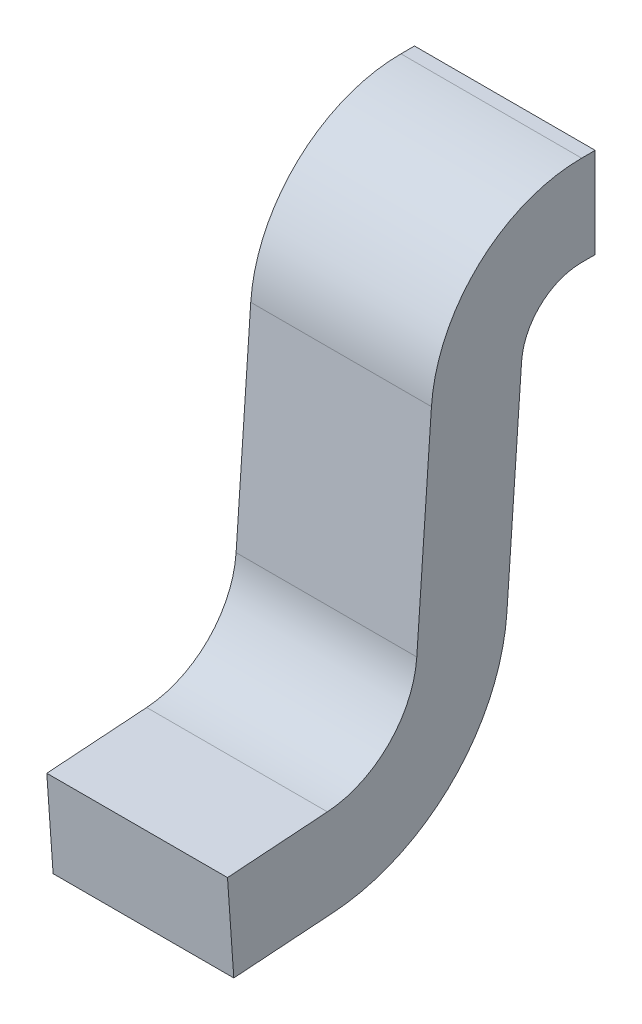
ISO-10303-21;
HEADER;
FILE_DESCRIPTION(('STEP AP214'),'2;1');
FILE_NAME('part.step','',(''),(''),'','','');
FILE_SCHEMA(('AUTOMOTIVE_DESIGN { 1 0 10303 214 1 1 1 1 }'));
ENDSEC;
DATA;
#1=APPLICATION_CONTEXT('core data for automotive mechanical design processes');
#2=APPLICATION_PROTOCOL_DEFINITION('international standard','automotive_design',2000,#1);
#3=PRODUCT_CONTEXT('',#1,'mechanical');
#4=PRODUCT('Part','Part','',(#3));
#5=PRODUCT_RELATED_PRODUCT_CATEGORY('part','',(#4));
#6=PRODUCT_DEFINITION_FORMATION('','',#4);
#7=PRODUCT_DEFINITION_CONTEXT('part definition',#1,'design');
#8=PRODUCT_DEFINITION('design','',#6,#7);
#9=PRODUCT_DEFINITION_SHAPE('','',#8);
#10=(LENGTH_UNIT() NAMED_UNIT(*) SI_UNIT(.MILLI.,.METRE.));
#11=(NAMED_UNIT(*) PLANE_ANGLE_UNIT() SI_UNIT($,.RADIAN.));
#12=(NAMED_UNIT(*) SI_UNIT($,.STERADIAN.) SOLID_ANGLE_UNIT());
#13=UNCERTAINTY_MEASURE_WITH_UNIT(LENGTH_MEASURE(1.E-05),#10,'distance_accuracy_value','');
#14=(GEOMETRIC_REPRESENTATION_CONTEXT(3) GLOBAL_UNCERTAINTY_ASSIGNED_CONTEXT((#13)) GLOBAL_UNIT_ASSIGNED_CONTEXT((#10,
#11,#12)) REPRESENTATION_CONTEXT('',''));
#15=CARTESIAN_POINT('',(0.,0.,0.));
#16=DIRECTION('',(0.,0.,1.));
#17=DIRECTION('',(1.,0.,0.));
#18=AXIS2_PLACEMENT_3D('',#15,#16,#17);
#19=CARTESIAN_POINT('',(0.15,0.,0.));
#20=DIRECTION('',(1.,0.,0.));
#21=DIRECTION('',(0.,1.,0.));
#22=AXIS2_PLACEMENT_3D('',#19,#20,#21);
#23=PLANE('',#22);
#24=DIRECTION('',(0.,-0.997564050259825,0.0697564737441177));
#25=VECTOR('',#24,1.);
#26=CARTESIAN_POINT('',(0.15,0.407439118436,0.121875366099));
#27=LINE('',#26,#25);
#28=CARTESIAN_POINT('',(0.15,0.407439118436,0.121875366099));
#29=VERTEX_POINT('',#28);
#30=CARTESIAN_POINT('',(0.15,0.05967916399889,0.146193111034));
#31=VERTEX_POINT('',#30);
#32=EDGE_CURVE('E11',#29,#31,#27,.T.);
#33=ORIENTED_EDGE('',*,*,#32,.T.);
#34=CARTESIAN_POINT('',(0.15,0.07084019979795,0.305803359076));
#35=DIRECTION('',(1.,0.,0.));
#36=DIRECTION('',(0.,-0.997564050259825,-0.0697564737441178));
#37=AXIS2_PLACEMENT_3D('',#34,#35,#36);
#38=CIRCLE('',#37,0.16);
#39=CARTESIAN_POINT('',(0.15,-0.08877004824362,0.294642323277));
#40=VERTEX_POINT('',#39);
#41=EDGE_CURVE('E42',#40,#31,#38,.T.);
#42=ORIENTED_EDGE('',*,*,#41,.F.);
#43=DIRECTION('',(0.,-0.0697564737441177,0.997564050259825));
#44=VECTOR('',#43,1.);
#45=CARTESIAN_POINT('',(0.15,-0.08877004824362,0.294642323277));
#46=LINE('',#45,#44);
#47=CARTESIAN_POINT('',(0.15,-0.100365392461,0.460463471062));
#48=VERTEX_POINT('',#47);
#49=EDGE_CURVE('E255',#40,#48,#46,.T.);
#50=ORIENTED_EDGE('',*,*,#49,.T.);
#51=DIRECTION('',(0.,-0.997564050259825,-0.0697564737441177));
#52=VECTOR('',#51,1.);
#53=CARTESIAN_POINT('',(0.15,-0.100365392461,0.460463471062));
#54=LINE('',#53,#52);
#55=CARTESIAN_POINT('',(0.15,-0.25,0.45));
#56=VERTEX_POINT('',#55);
#57=EDGE_CURVE('E234',#48,#56,#54,.T.);
#58=ORIENTED_EDGE('',*,*,#57,.T.);
#59=DIRECTION('',(0.,0.0697564737441177,-0.997564050259825));
#60=VECTOR('',#59,1.);
#61=CARTESIAN_POINT('',(0.15,-0.25,0.45));
#62=LINE('',#61,#60);
#63=CARTESIAN_POINT('',(0.15,-0.238404655783,0.284178852215));
#64=VERTEX_POINT('',#63);
#65=EDGE_CURVE('E235',#56,#64,#62,.T.);
#66=ORIENTED_EDGE('',*,*,#65,.T.);
#67=CARTESIAN_POINT('',(0.15,0.07084019979795,0.305803359076));
#68=DIRECTION('',(-1.,0.,0.));
#69=DIRECTION('',(0.,-0.0697564737441178,-0.997564050259825));
#70=AXIS2_PLACEMENT_3D('',#67,#68,#69);
#71=CIRCLE('',#70,0.31);
#72=CARTESIAN_POINT('',(0.15,0.04921569293727,-0.003441496504694));
#73=VERTEX_POINT('',#72);
#74=EDGE_CURVE('E239',#73,#64,#71,.T.);
#75=ORIENTED_EDGE('',*,*,#74,.F.);
#76=DIRECTION('',(0.,0.997564050259825,-0.0697564737441177));
#77=VECTOR('',#76,1.);
#78=CARTESIAN_POINT('',(0.15,0.04921569293727,-0.003441496504694));
#79=LINE('',#78,#77);
#80=CARTESIAN_POINT('',(0.15,0.396975647374,-0.0277592414401));
#81=VERTEX_POINT('',#80);
#82=EDGE_CURVE('E226',#73,#81,#79,.T.);
#83=ORIENTED_EDGE('',*,*,#82,.T.);
#84=CARTESIAN_POINT('',(0.15,0.39,-0.127515646466));
#85=DIRECTION('',(-1.,0.,0.));
#86=DIRECTION('',(0.,0.0697564737441177,0.997564050259825));
#87=AXIS2_PLACEMENT_3D('',#84,#85,#86);
#88=CIRCLE('',#87,0.1);
#89=CARTESIAN_POINT('',(0.15,0.49,-0.127515646466));
#90=VERTEX_POINT('',#89);
#91=EDGE_CURVE('E172',#81,#90,#88,.T.);
#92=ORIENTED_EDGE('',*,*,#91,.T.);
#93=DIRECTION('',(0.,0.,-1.));
#94=VECTOR('',#93,1.);
#95=CARTESIAN_POINT('',(0.15,0.49,-0.127515646466));
#96=LINE('',#95,#94);
#97=CARTESIAN_POINT('',(0.15,0.49,-0.15));
#98=VERTEX_POINT('',#97);
#99=EDGE_CURVE('E173',#90,#98,#96,.T.);
#100=ORIENTED_EDGE('',*,*,#99,.T.);
#101=DIRECTION('',(0.,1.,0.));
#102=VECTOR('',#101,1.);
#103=CARTESIAN_POINT('',(0.15,0.49,-0.15));
#104=LINE('',#103,#102);
#105=CARTESIAN_POINT('',(0.15,0.64,-0.15));
#106=VERTEX_POINT('',#105);
#107=EDGE_CURVE('E144',#98,#106,#104,.T.);
#108=ORIENTED_EDGE('',*,*,#107,.T.);
#109=DIRECTION('',(0.,0.,1.));
#110=VECTOR('',#109,1.);
#111=CARTESIAN_POINT('',(0.15,0.64,-0.15));
#112=LINE('',#111,#110);
#113=CARTESIAN_POINT('',(0.15,0.64,-0.127515646466));
#114=VERTEX_POINT('',#113);
#115=EDGE_CURVE('E140',#106,#114,#112,.T.);
#116=ORIENTED_EDGE('',*,*,#115,.T.);
#117=CARTESIAN_POINT('',(0.15,0.39,-0.127515646466));
#118=DIRECTION('',(1.,0.,0.));
#119=DIRECTION('',(0.,1.,0.));
#120=AXIS2_PLACEMENT_3D('',#117,#118,#119);
#121=CIRCLE('',#120,0.25);
#122=EDGE_CURVE('E211',#114,#29,#121,.T.);
#123=ORIENTED_EDGE('',*,*,#122,.T.);
#124=EDGE_LOOP('',(#33,#42,#50,#58,#66,#75,#83,#92,#100,#108,#116,#123));
#125=FACE_BOUND('',#124,.T.);
#126=ADVANCED_FACE('F17',(#125),#23,.T.);
#127=CARTESIAN_POINT('',(-0.15,0.01046347106162,0.149634607539));
#128=DIRECTION('',(0.,0.0697564737441177,0.997564050259825));
#129=DIRECTION('',(1.,0.,0.));
#130=AXIS2_PLACEMENT_3D('',#127,#128,#129);
#131=PLANE('',#130);
#132=DIRECTION('',(0.,0.997564050259825,-0.0697564737441177));
#133=VECTOR('',#132,1.);
#134=CARTESIAN_POINT('',(-0.15,0.05967916399889,0.146193111034));
#135=LINE('',#134,#133);
#136=CARTESIAN_POINT('',(-0.15,0.05967916399889,0.146193111034));
#137=VERTEX_POINT('',#136);
#138=CARTESIAN_POINT('',(-0.15,0.407439118436,0.121875366099));
#139=VERTEX_POINT('',#138);
#140=EDGE_CURVE('E195',#137,#139,#135,.T.);
#141=ORIENTED_EDGE('',*,*,#140,.F.);
#142=DIRECTION('',(1.,0.,0.));
#143=VECTOR('',#142,1.);
#144=CARTESIAN_POINT('',(-0.15,0.05967916399889,0.146193111034));
#145=LINE('',#144,#143);
#146=EDGE_CURVE('E25',#137,#31,#145,.T.);
#147=ORIENTED_EDGE('',*,*,#146,.T.);
#148=ORIENTED_EDGE('',*,*,#32,.F.);
#149=DIRECTION('',(-1.,0.,0.));
#150=VECTOR('',#149,1.);
#151=CARTESIAN_POINT('',(0.15,0.407439118436,0.121875366099));
#152=LINE('',#151,#150);
#153=EDGE_CURVE('E214',#29,#139,#152,.T.);
#154=ORIENTED_EDGE('',*,*,#153,.T.);
#155=EDGE_LOOP('',(#141,#147,#148,#154));
#156=FACE_BOUND('',#155,.T.);
#157=ADVANCED_FACE('F267',(#156),#131,.T.);
#158=CARTESIAN_POINT('',(-0.15,0.07084019979795,0.305803359076));
#159=DIRECTION('',(1.,0.,0.));
#160=DIRECTION('',(0.,-0.997564050259825,-0.0697564737441178));
#161=AXIS2_PLACEMENT_3D('',#158,#159,#160);
#162=CYLINDRICAL_SURFACE('',#161,0.16);
#163=ORIENTED_EDGE('',*,*,#41,.T.);
#164=ORIENTED_EDGE('',*,*,#146,.F.);
#165=CARTESIAN_POINT('',(-0.15,0.07084019979795,0.305803359076));
#166=DIRECTION('',(1.,0.,0.));
#167=DIRECTION('',(0.,-0.997564050259825,-0.0697564737441178));
#168=AXIS2_PLACEMENT_3D('',#165,#166,#167);
#169=CIRCLE('',#168,0.16);
#170=CARTESIAN_POINT('',(-0.15,-0.08877004824362,0.294642323277));
#171=VERTEX_POINT('',#170);
#172=EDGE_CURVE('E181',#171,#137,#169,.T.);
#173=ORIENTED_EDGE('',*,*,#172,.F.);
#174=DIRECTION('',(1.,0.,0.));
#175=VECTOR('',#174,1.);
#176=CARTESIAN_POINT('',(-0.15,-0.08877004824362,0.294642323277));
#177=LINE('',#176,#175);
#178=EDGE_CURVE('E258',#171,#40,#177,.T.);
#179=ORIENTED_EDGE('',*,*,#178,.T.);
#180=EDGE_LOOP('',(#163,#164,#173,#179));
#181=FACE_BOUND('',#180,.T.);
#182=ADVANCED_FACE('F270',(#181),#162,.F.);
#183=CARTESIAN_POINT('',(-0.15,-0.0790679078432,0.155895251435));
#184=DIRECTION('',(0.,0.997564050259825,0.0697564737441177));
#185=DIRECTION('',(1.,0.,0.));
#186=AXIS2_PLACEMENT_3D('',#183,#184,#185);
#187=PLANE('',#186);
#188=DIRECTION('',(1.,0.,0.));
#189=VECTOR('',#188,1.);
#190=CARTESIAN_POINT('',(-0.15,-0.100365392461,0.460463471062));
#191=LINE('',#190,#189);
#192=CARTESIAN_POINT('',(-0.15,-0.100365392461,0.460463471062));
#193=VERTEX_POINT('',#192);
#194=EDGE_CURVE('E251',#193,#48,#191,.T.);
#195=ORIENTED_EDGE('',*,*,#194,.T.);
#196=ORIENTED_EDGE('',*,*,#49,.F.);
#197=ORIENTED_EDGE('',*,*,#178,.F.);
#198=DIRECTION('',(0.,-0.0697564737441177,0.997564050259825));
#199=VECTOR('',#198,1.);
#200=CARTESIAN_POINT('',(-0.15,-0.08877004824362,0.294642323277));
#201=LINE('',#200,#199);
#202=EDGE_CURVE('E177',#171,#193,#201,.T.);
#203=ORIENTED_EDGE('',*,*,#202,.T.);
#204=EDGE_LOOP('',(#195,#196,#197,#203));
#205=FACE_BOUND('',#204,.T.);
#206=ADVANCED_FACE('F274',(#205),#187,.T.);
#207=CARTESIAN_POINT('',(-0.15,-0.100365392461,0.460463471062));
#208=DIRECTION('',(0.,-0.0697564737441177,0.997564050259825));
#209=DIRECTION('',(-1.,0.,0.));
#210=AXIS2_PLACEMENT_3D('',#207,#208,#209);
#211=PLANE('',#210);
#212=DIRECTION('',(1.,0.,0.));
#213=VECTOR('',#212,1.);
#214=CARTESIAN_POINT('',(-0.15,-0.25,0.45));
#215=LINE('',#214,#213);
#216=CARTESIAN_POINT('',(-0.15,-0.25,0.45));
#217=VERTEX_POINT('',#216);
#218=EDGE_CURVE('E230',#217,#56,#215,.T.);
#219=ORIENTED_EDGE('',*,*,#218,.T.);
#220=ORIENTED_EDGE('',*,*,#57,.F.);
#221=ORIENTED_EDGE('',*,*,#194,.F.);
#222=DIRECTION('',(0.,-0.997564050259825,-0.0697564737441177));
#223=VECTOR('',#222,1.);
#224=CARTESIAN_POINT('',(-0.15,-0.100365392461,0.460463471062));
#225=LINE('',#224,#223);
#226=EDGE_CURVE('E182',#193,#217,#225,.T.);
#227=ORIENTED_EDGE('',*,*,#226,.T.);
#228=EDGE_LOOP('',(#219,#220,#221,#227));
#229=FACE_BOUND('',#228,.T.);
#230=ADVANCED_FACE('F278',(#229),#211,.T.);
#231=CARTESIAN_POINT('',(-0.15,-0.25,0.45));
#232=DIRECTION('',(0.,-0.997564050259825,-0.0697564737441177));
#233=DIRECTION('',(0.,0.0697564737441177,-0.997564050259825));
#234=AXIS2_PLACEMENT_3D('',#231,#232,#233);
#235=PLANE('',#234);
#236=DIRECTION('',(1.,0.,0.));
#237=VECTOR('',#236,1.);
#238=CARTESIAN_POINT('',(-0.15,-0.238404655783,0.284178852215));
#239=LINE('',#238,#237);
#240=CARTESIAN_POINT('',(-0.15,-0.238404655783,0.284178852215));
#241=VERTEX_POINT('',#240);
#242=EDGE_CURVE('E243',#241,#64,#239,.T.);
#243=ORIENTED_EDGE('',*,*,#242,.T.);
#244=ORIENTED_EDGE('',*,*,#65,.F.);
#245=ORIENTED_EDGE('',*,*,#218,.F.);
#246=DIRECTION('',(0.,0.0697564737441177,-0.997564050259825));
#247=VECTOR('',#246,1.);
#248=CARTESIAN_POINT('',(-0.15,-0.25,0.45));
#249=LINE('',#248,#247);
#250=EDGE_CURVE('E186',#217,#241,#249,.T.);
#251=ORIENTED_EDGE('',*,*,#250,.T.);
#252=EDGE_LOOP('',(#243,#244,#245,#251));
#253=FACE_BOUND('',#252,.T.);
#254=ADVANCED_FACE('F282',(#253),#235,.T.);
#255=CARTESIAN_POINT('',(-0.15,0.07084019979795,0.305803359076));
#256=DIRECTION('',(-1.,0.,0.));
#257=DIRECTION('',(0.,-0.0697564737441178,-0.997564050259825));
#258=AXIS2_PLACEMENT_3D('',#255,#256,#257);
#259=CYLINDRICAL_SURFACE('',#258,0.31);
#260=ORIENTED_EDGE('',*,*,#74,.T.);
#261=ORIENTED_EDGE('',*,*,#242,.F.);
#262=CARTESIAN_POINT('',(-0.15,0.07084019979795,0.305803359076));
#263=DIRECTION('',(-1.,0.,0.));
#264=DIRECTION('',(0.,-0.0697564737441178,-0.997564050259825));
#265=AXIS2_PLACEMENT_3D('',#262,#263,#264);
#266=CIRCLE('',#265,0.31);
#267=CARTESIAN_POINT('',(-0.15,0.04921569293727,-0.003441496504694));
#268=VERTEX_POINT('',#267);
#269=EDGE_CURVE('E199',#268,#241,#266,.T.);
#270=ORIENTED_EDGE('',*,*,#269,.F.);
#271=DIRECTION('',(1.,0.,0.));
#272=VECTOR('',#271,1.);
#273=CARTESIAN_POINT('',(-0.15,0.04921569293727,-0.003441496504694));
#274=LINE('',#273,#272);
#275=EDGE_CURVE('E229',#268,#73,#274,.T.);
#276=ORIENTED_EDGE('',*,*,#275,.T.);
#277=EDGE_LOOP('',(#260,#261,#270,#276));
#278=FACE_BOUND('',#277,.T.);
#279=ADVANCED_FACE('F285',(#278),#259,.T.);
#280=CARTESIAN_POINT('',(-0.15,-0.219606758757,0.01535640052111));
#281=DIRECTION('',(0.,-0.0697564737441177,-0.997564050259825));
#282=DIRECTION('',(0.,-0.997564050259825,0.0697564737441177));
#283=AXIS2_PLACEMENT_3D('',#280,#281,#282);
#284=PLANE('',#283);
#285=ORIENTED_EDGE('',*,*,#82,.F.);
#286=ORIENTED_EDGE('',*,*,#275,.F.);
#287=DIRECTION('',(0.,-0.997564050259825,0.0697564737441177));
#288=VECTOR('',#287,1.);
#289=CARTESIAN_POINT('',(-0.15,0.396975647374,-0.0277592414401));
#290=LINE('',#289,#288);
#291=CARTESIAN_POINT('',(-0.15,0.396975647374,-0.0277592414401));
#292=VERTEX_POINT('',#291);
#293=EDGE_CURVE('E191',#292,#268,#290,.T.);
#294=ORIENTED_EDGE('',*,*,#293,.F.);
#295=DIRECTION('',(-1.,0.,0.));
#296=VECTOR('',#295,1.);
#297=CARTESIAN_POINT('',(0.15,0.396975647374,-0.0277592414401));
#298=LINE('',#297,#296);
#299=EDGE_CURVE('E223',#81,#292,#298,.T.);
#300=ORIENTED_EDGE('',*,*,#299,.F.);
#301=EDGE_LOOP('',(#285,#286,#294,#300));
#302=FACE_BOUND('',#301,.T.);
#303=ADVANCED_FACE('F292',(#302),#284,.T.);
#304=CARTESIAN_POINT('',(0.54108,0.39,-0.127515646466));
#305=DIRECTION('',(-1.,0.,0.));
#306=DIRECTION('',(0.,0.0697564737441078,0.997564050259826));
#307=AXIS2_PLACEMENT_3D('',#304,#305,#306);
#308=CYLINDRICAL_SURFACE('',#307,0.1);
#309=CARTESIAN_POINT('',(-0.15,0.39,-0.127515646466));
#310=DIRECTION('',(1.,0.,0.));
#311=DIRECTION('',(0.,1.,0.));
#312=AXIS2_PLACEMENT_3D('',#309,#310,#311);
#313=CIRCLE('',#312,0.1);
#314=CARTESIAN_POINT('',(-0.15,0.49,-0.127515646466));
#315=VERTEX_POINT('',#314);
#316=EDGE_CURVE('E187',#315,#292,#313,.T.);
#317=ORIENTED_EDGE('',*,*,#316,.F.);
#318=DIRECTION('',(-1.,0.,0.));
#319=VECTOR('',#318,1.);
#320=CARTESIAN_POINT('',(0.15,0.49,-0.127515646466));
#321=LINE('',#320,#319);
#322=EDGE_CURVE('E170',#90,#315,#321,.T.);
#323=ORIENTED_EDGE('',*,*,#322,.F.);
#324=ORIENTED_EDGE('',*,*,#91,.F.);
#325=ORIENTED_EDGE('',*,*,#299,.T.);
#326=EDGE_LOOP('',(#317,#323,#324,#325));
#327=FACE_BOUND('',#326,.T.);
#328=ADVANCED_FACE('F295',(#327),#308,.F.);
#329=CARTESIAN_POINT('',(-0.15,0.49,-0.03426413785232));
#330=DIRECTION('',(0.,-1.,0.));
#331=DIRECTION('',(0.,0.,-1.));
#332=AXIS2_PLACEMENT_3D('',#329,#330,#331);
#333=PLANE('',#332);
#334=DIRECTION('',(0.,0.,-1.));
#335=VECTOR('',#334,1.);
#336=CARTESIAN_POINT('',(-0.15,0.49,-0.127515646466));
#337=LINE('',#336,#335);
#338=CARTESIAN_POINT('',(-0.15,0.49,-0.15));
#339=VERTEX_POINT('',#338);
#340=EDGE_CURVE('E155',#315,#339,#337,.T.);
#341=ORIENTED_EDGE('',*,*,#340,.T.);
#342=DIRECTION('',(1.,0.,0.));
#343=VECTOR('',#342,1.);
#344=CARTESIAN_POINT('',(-0.15,0.49,-0.15));
#345=LINE('',#344,#343);
#346=EDGE_CURVE('E150',#339,#98,#345,.T.);
#347=ORIENTED_EDGE('',*,*,#346,.T.);
#348=ORIENTED_EDGE('',*,*,#99,.F.);
#349=ORIENTED_EDGE('',*,*,#322,.T.);
#350=EDGE_LOOP('',(#341,#347,#348,#349));
#351=FACE_BOUND('',#350,.T.);
#352=ADVANCED_FACE('F298',(#351),#333,.T.);
#353=CARTESIAN_POINT('',(-0.15,0.49,-0.15));
#354=DIRECTION('',(0.,0.,-1.));
#355=DIRECTION('',(0.,-1.,0.));
#356=AXIS2_PLACEMENT_3D('',#353,#354,#355);
#357=PLANE('',#356);
#358=DIRECTION('',(1.,0.,0.));
#359=VECTOR('',#358,1.);
#360=CARTESIAN_POINT('',(-0.15,0.64,-0.15));
#361=LINE('',#360,#359);
#362=CARTESIAN_POINT('',(-0.15,0.64,-0.15));
#363=VERTEX_POINT('',#362);
#364=EDGE_CURVE('E134',#363,#106,#361,.T.);
#365=ORIENTED_EDGE('',*,*,#364,.T.);
#366=ORIENTED_EDGE('',*,*,#107,.F.);
#367=ORIENTED_EDGE('',*,*,#346,.F.);
#368=DIRECTION('',(0.,1.,0.));
#369=VECTOR('',#368,1.);
#370=CARTESIAN_POINT('',(-0.15,0.49,-0.15));
#371=LINE('',#370,#369);
#372=EDGE_CURVE('E147',#339,#363,#371,.T.);
#373=ORIENTED_EDGE('',*,*,#372,.T.);
#374=EDGE_LOOP('',(#365,#366,#367,#373));
#375=FACE_BOUND('',#374,.T.);
#376=ADVANCED_FACE('F148',(#375),#357,.T.);
#377=CARTESIAN_POINT('',(-0.15,0.64,-0.15));
#378=DIRECTION('',(0.,1.,0.));
#379=DIRECTION('',(1.,0.,0.));
#380=AXIS2_PLACEMENT_3D('',#377,#378,#379);
#381=PLANE('',#380);
#382=ORIENTED_EDGE('',*,*,#115,.F.);
#383=ORIENTED_EDGE('',*,*,#364,.F.);
#384=DIRECTION('',(0.,0.,1.));
#385=VECTOR('',#384,1.);
#386=CARTESIAN_POINT('',(-0.15,0.64,-0.15));
#387=LINE('',#386,#385);
#388=CARTESIAN_POINT('',(-0.15,0.64,-0.127515646466));
#389=VERTEX_POINT('',#388);
#390=EDGE_CURVE('E139',#363,#389,#387,.T.);
#391=ORIENTED_EDGE('',*,*,#390,.T.);
#392=DIRECTION('',(-1.,0.,0.));
#393=VECTOR('',#392,1.);
#394=CARTESIAN_POINT('',(0.15,0.64,-0.127515646466));
#395=LINE('',#394,#393);
#396=EDGE_CURVE('E208',#114,#389,#395,.T.);
#397=ORIENTED_EDGE('',*,*,#396,.F.);
#398=EDGE_LOOP('',(#382,#383,#391,#397));
#399=FACE_BOUND('',#398,.T.);
#400=ADVANCED_FACE('F136',(#399),#381,.T.);
#401=CARTESIAN_POINT('',(0.54108,0.39,-0.127515646466));
#402=DIRECTION('',(-1.,0.,0.));
#403=DIRECTION('',(0.,0.0697564737441177,0.997564050259825));
#404=AXIS2_PLACEMENT_3D('',#401,#402,#403);
#405=CYLINDRICAL_SURFACE('',#404,0.25);
#406=ORIENTED_EDGE('',*,*,#153,.F.);
#407=ORIENTED_EDGE('',*,*,#122,.F.);
#408=ORIENTED_EDGE('',*,*,#396,.T.);
#409=CARTESIAN_POINT('',(-0.15,0.39,-0.127515646466));
#410=DIRECTION('',(-1.,0.,0.));
#411=DIRECTION('',(0.,0.0697564737441177,0.997564050259825));
#412=AXIS2_PLACEMENT_3D('',#409,#410,#411);
#413=CIRCLE('',#412,0.25);
#414=EDGE_CURVE('E161',#139,#389,#413,.T.);
#415=ORIENTED_EDGE('',*,*,#414,.F.);
#416=EDGE_LOOP('',(#406,#407,#408,#415));
#417=FACE_BOUND('',#416,.T.);
#418=ADVANCED_FACE('F304',(#417),#405,.T.);
#419=CARTESIAN_POINT('',(-0.15,0.,0.));
#420=DIRECTION('',(1.,0.,0.));
#421=DIRECTION('',(0.,1.,0.));
#422=AXIS2_PLACEMENT_3D('',#419,#420,#421);
#423=PLANE('',#422);
#424=ORIENTED_EDGE('',*,*,#390,.F.);
#425=ORIENTED_EDGE('',*,*,#372,.F.);
#426=ORIENTED_EDGE('',*,*,#340,.F.);
#427=ORIENTED_EDGE('',*,*,#316,.T.);
#428=ORIENTED_EDGE('',*,*,#293,.T.);
#429=ORIENTED_EDGE('',*,*,#269,.T.);
#430=ORIENTED_EDGE('',*,*,#250,.F.);
#431=ORIENTED_EDGE('',*,*,#226,.F.);
#432=ORIENTED_EDGE('',*,*,#202,.F.);
#433=ORIENTED_EDGE('',*,*,#172,.T.);
#434=ORIENTED_EDGE('',*,*,#140,.T.);
#435=ORIENTED_EDGE('',*,*,#414,.T.);
#436=EDGE_LOOP('',(#424,#425,#426,#427,#428,#429,#430,#431,#432,#433,#434,#435));
#437=FACE_BOUND('',#436,.T.);
#438=ADVANCED_FACE('F158',(#437),#423,.F.);
#439=CLOSED_SHELL('',(#126,#157,#182,#206,#230,#254,#279,#303,#328,#352,#376,#400,#418,#438));
#440=MANIFOLD_SOLID_BREP('B1',#439);
#441=ADVANCED_BREP_SHAPE_REPRESENTATION('',(#18,#440),#14);
#442=SHAPE_DEFINITION_REPRESENTATION(#9,#441);
ENDSEC;
END-ISO-10303-21;
